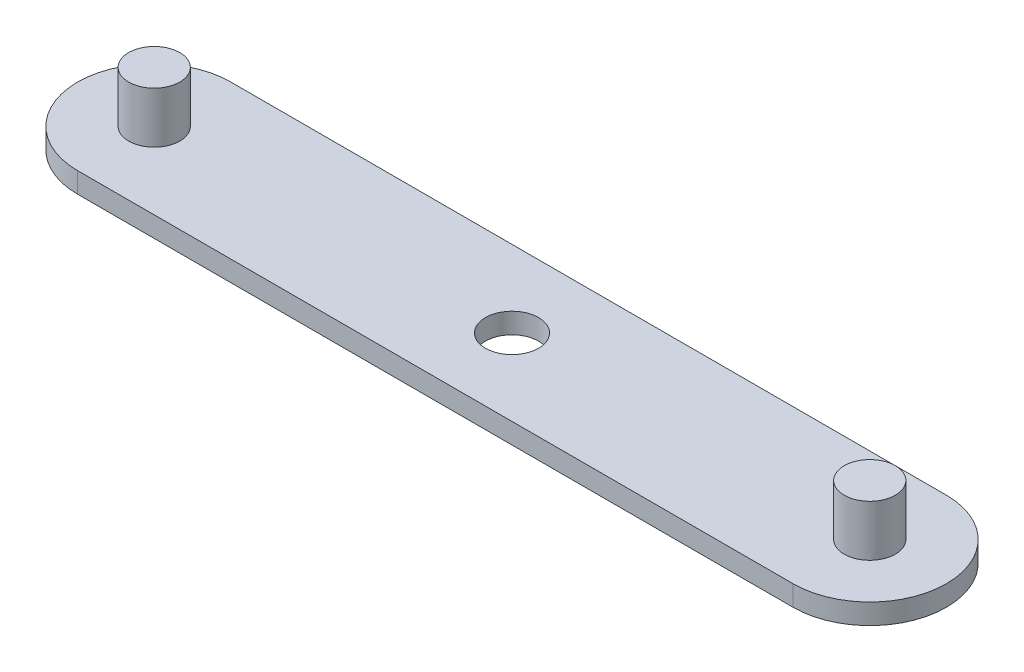
ISO-10303-21;
HEADER;
FILE_DESCRIPTION(('STEP AP214'),'2;1');
FILE_NAME('part.step','',(''),(''),'','','');
FILE_SCHEMA(('AUTOMOTIVE_DESIGN { 1 0 10303 214 1 1 1 1 }'));
ENDSEC;
DATA;
#1=APPLICATION_CONTEXT('core data for automotive mechanical design processes');
#2=APPLICATION_PROTOCOL_DEFINITION('international standard','automotive_design',2000,#1);
#3=PRODUCT_CONTEXT('',#1,'mechanical');
#4=PRODUCT('Part','Part','',(#3));
#5=PRODUCT_RELATED_PRODUCT_CATEGORY('part','',(#4));
#6=PRODUCT_DEFINITION_FORMATION('','',#4);
#7=PRODUCT_DEFINITION_CONTEXT('part definition',#1,'design');
#8=PRODUCT_DEFINITION('design','',#6,#7);
#9=PRODUCT_DEFINITION_SHAPE('','',#8);
#10=(LENGTH_UNIT() NAMED_UNIT(*) SI_UNIT(.MILLI.,.METRE.));
#11=(NAMED_UNIT(*) PLANE_ANGLE_UNIT() SI_UNIT($,.RADIAN.));
#12=(NAMED_UNIT(*) SI_UNIT($,.STERADIAN.) SOLID_ANGLE_UNIT());
#13=UNCERTAINTY_MEASURE_WITH_UNIT(LENGTH_MEASURE(1.E-05),#10,'distance_accuracy_value','');
#14=(GEOMETRIC_REPRESENTATION_CONTEXT(3) GLOBAL_UNCERTAINTY_ASSIGNED_CONTEXT((#13)) GLOBAL_UNIT_ASSIGNED_CONTEXT((#10,
#11,#12)) REPRESENTATION_CONTEXT('',''));
#15=CARTESIAN_POINT('',(0.,0.,0.));
#16=DIRECTION('',(0.,0.,1.));
#17=DIRECTION('',(1.,0.,0.));
#18=AXIS2_PLACEMENT_3D('',#15,#16,#17);
#19=CARTESIAN_POINT('',(-44.45,2.54,0.));
#20=DIRECTION('',(0.,-1.,0.));
#21=DIRECTION('',(0.,0.,-1.));
#22=AXIS2_PLACEMENT_3D('',#19,#20,#21);
#23=CYLINDRICAL_SURFACE('',#22,9.525);
#24=CARTESIAN_POINT('',(-44.45,0.,0.));
#25=DIRECTION('',(0.,1.,0.));
#26=DIRECTION('',(0.,0.,1.));
#27=AXIS2_PLACEMENT_3D('',#24,#25,#26);
#28=CIRCLE('',#27,9.525);
#29=CARTESIAN_POINT('',(-44.45,0.,9.525));
#30=VERTEX_POINT('',#29);
#31=CARTESIAN_POINT('',(-44.45,0.,-9.525));
#32=VERTEX_POINT('',#31);
#33=EDGE_CURVE('E96',#30,#32,#28,.F.);
#34=ORIENTED_EDGE('',*,*,#33,.F.);
#35=DIRECTION('',(0.,-1.,0.));
#36=VECTOR('',#35,1.);
#37=CARTESIAN_POINT('',(-44.45,2.54,9.525));
#38=LINE('',#37,#36);
#39=CARTESIAN_POINT('',(-44.45,2.54,9.525));
#40=VERTEX_POINT('',#39);
#41=EDGE_CURVE('E11',#40,#30,#38,.T.);
#42=ORIENTED_EDGE('',*,*,#41,.F.);
#43=CARTESIAN_POINT('',(-44.45,2.54,0.));
#44=DIRECTION('',(0.,1.,0.));
#45=DIRECTION('',(0.,0.,1.));
#46=AXIS2_PLACEMENT_3D('',#43,#44,#45);
#47=CIRCLE('',#46,9.525);
#48=CARTESIAN_POINT('',(-44.45,2.54,-9.525));
#49=VERTEX_POINT('',#48);
#50=EDGE_CURVE('E81',#40,#49,#47,.F.);
#51=ORIENTED_EDGE('',*,*,#50,.T.);
#52=DIRECTION('',(0.,-1.,0.));
#53=VECTOR('',#52,1.);
#54=CARTESIAN_POINT('',(-44.45,2.54,-9.525));
#55=LINE('',#54,#53);
#56=EDGE_CURVE('E49',#49,#32,#55,.T.);
#57=ORIENTED_EDGE('',*,*,#56,.T.);
#58=EDGE_LOOP('',(#34,#42,#51,#57));
#59=FACE_BOUND('',#58,.T.);
#60=ADVANCED_FACE('F33',(#59),#23,.T.);
#61=CARTESIAN_POINT('',(0.,2.54,9.525));
#62=DIRECTION('',(0.,0.,-1.));
#63=DIRECTION('',(-1.,0.,0.));
#64=AXIS2_PLACEMENT_3D('',#61,#62,#63);
#65=PLANE('',#64);
#66=DIRECTION('',(1.,0.,0.));
#67=VECTOR('',#66,1.);
#68=CARTESIAN_POINT('',(0.,0.,9.525));
#69=LINE('',#68,#67);
#70=CARTESIAN_POINT('',(44.45,0.,9.525));
#71=VERTEX_POINT('',#70);
#72=EDGE_CURVE('E87',#30,#71,#69,.T.);
#73=ORIENTED_EDGE('',*,*,#72,.T.);
#74=DIRECTION('',(0.,-1.,0.));
#75=VECTOR('',#74,1.);
#76=CARTESIAN_POINT('',(44.45,2.54,9.525));
#77=LINE('',#76,#75);
#78=CARTESIAN_POINT('',(44.45,2.54,9.525));
#79=VERTEX_POINT('',#78);
#80=EDGE_CURVE('E41',#79,#71,#77,.T.);
#81=ORIENTED_EDGE('',*,*,#80,.F.);
#82=DIRECTION('',(1.,0.,0.));
#83=VECTOR('',#82,1.);
#84=CARTESIAN_POINT('',(0.,2.54,9.525));
#85=LINE('',#84,#83);
#86=EDGE_CURVE('E75',#40,#79,#85,.T.);
#87=ORIENTED_EDGE('',*,*,#86,.F.);
#88=ORIENTED_EDGE('',*,*,#41,.T.);
#89=EDGE_LOOP('',(#73,#81,#87,#88));
#90=FACE_BOUND('',#89,.T.);
#91=ADVANCED_FACE('F85',(#90),#65,.F.);
#92=CARTESIAN_POINT('',(44.45,2.54,0.));
#93=DIRECTION('',(0.,-1.,0.));
#94=DIRECTION('',(0.,0.,-1.));
#95=AXIS2_PLACEMENT_3D('',#92,#93,#94);
#96=CYLINDRICAL_SURFACE('',#95,9.525);
#97=CARTESIAN_POINT('',(44.45,0.,0.));
#98=DIRECTION('',(0.,1.,0.));
#99=DIRECTION('',(0.,0.,1.));
#100=AXIS2_PLACEMENT_3D('',#97,#98,#99);
#101=CIRCLE('',#100,9.525);
#102=CARTESIAN_POINT('',(44.45,0.,-9.525));
#103=VERTEX_POINT('',#102);
#104=EDGE_CURVE('E100',#103,#71,#101,.F.);
#105=ORIENTED_EDGE('',*,*,#104,.F.);
#106=DIRECTION('',(0.,-1.,0.));
#107=VECTOR('',#106,1.);
#108=CARTESIAN_POINT('',(44.45,2.54,-9.525));
#109=LINE('',#108,#107);
#110=CARTESIAN_POINT('',(44.45,2.54,-9.525));
#111=VERTEX_POINT('',#110);
#112=EDGE_CURVE('E62',#111,#103,#109,.T.);
#113=ORIENTED_EDGE('',*,*,#112,.F.);
#114=CARTESIAN_POINT('',(44.45,2.54,0.));
#115=DIRECTION('',(0.,1.,0.));
#116=DIRECTION('',(0.,0.,1.));
#117=AXIS2_PLACEMENT_3D('',#114,#115,#116);
#118=CIRCLE('',#117,9.525);
#119=EDGE_CURVE('E80',#111,#79,#118,.F.);
#120=ORIENTED_EDGE('',*,*,#119,.T.);
#121=ORIENTED_EDGE('',*,*,#80,.T.);
#122=EDGE_LOOP('',(#105,#113,#120,#121));
#123=FACE_BOUND('',#122,.T.);
#124=ADVANCED_FACE('F90',(#123),#96,.T.);
#125=CARTESIAN_POINT('',(0.,2.54,-9.525));
#126=DIRECTION('',(0.,0.,-1.));
#127=DIRECTION('',(-1.,0.,0.));
#128=AXIS2_PLACEMENT_3D('',#125,#126,#127);
#129=PLANE('',#128);
#130=DIRECTION('',(1.,0.,0.));
#131=VECTOR('',#130,1.);
#132=CARTESIAN_POINT('',(0.,0.,-9.525));
#133=LINE('',#132,#131);
#134=EDGE_CURVE('E102',#32,#103,#133,.T.);
#135=ORIENTED_EDGE('',*,*,#134,.F.);
#136=ORIENTED_EDGE('',*,*,#56,.F.);
#137=DIRECTION('',(1.,0.,0.));
#138=VECTOR('',#137,1.);
#139=CARTESIAN_POINT('',(0.,2.54,-9.525));
#140=LINE('',#139,#138);
#141=EDGE_CURVE('E91',#49,#111,#140,.T.);
#142=ORIENTED_EDGE('',*,*,#141,.T.);
#143=ORIENTED_EDGE('',*,*,#112,.T.);
#144=EDGE_LOOP('',(#135,#136,#142,#143));
#145=FACE_BOUND('',#144,.T.);
#146=ADVANCED_FACE('F132',(#145),#129,.T.);
#147=CARTESIAN_POINT('',(0.,2.54,0.));
#148=DIRECTION('',(0.,1.,0.));
#149=DIRECTION('',(0.,0.,1.));
#150=AXIS2_PLACEMENT_3D('',#147,#148,#149);
#151=PLANE('',#150);
#152=CARTESIAN_POINT('',(0.,2.54,0.));
#153=DIRECTION('',(0.,1.,0.));
#154=DIRECTION('',(0.,0.,1.));
#155=AXIS2_PLACEMENT_3D('',#152,#153,#154);
#156=CIRCLE('',#155,3.302);
#157=CARTESIAN_POINT('',(0.,2.54,3.302));
#158=VERTEX_POINT('',#157);
#159=EDGE_CURVE('E122',#158,#158,#156,.T.);
#160=ORIENTED_EDGE('',*,*,#159,.F.);
#161=EDGE_LOOP('',(#160));
#162=FACE_BOUND('',#161,.T.);
#163=CARTESIAN_POINT('',(44.45,2.54,0.));
#164=DIRECTION('',(0.,1.,0.));
#165=DIRECTION('',(0.,0.,1.));
#166=AXIS2_PLACEMENT_3D('',#163,#164,#165);
#167=CIRCLE('',#166,3.175);
#168=CARTESIAN_POINT('',(44.45,2.54,3.175));
#169=VERTEX_POINT('',#168);
#170=EDGE_CURVE('E114',#169,#169,#167,.T.);
#171=ORIENTED_EDGE('',*,*,#170,.F.);
#172=EDGE_LOOP('',(#171));
#173=FACE_BOUND('',#172,.T.);
#174=CARTESIAN_POINT('',(-44.45,2.54,0.));
#175=DIRECTION('',(0.,1.,0.));
#176=DIRECTION('',(0.,0.,1.));
#177=AXIS2_PLACEMENT_3D('',#174,#175,#176);
#178=CIRCLE('',#177,3.175);
#179=CARTESIAN_POINT('',(-44.45,2.54,3.175));
#180=VERTEX_POINT('',#179);
#181=EDGE_CURVE('E108',#180,#180,#178,.T.);
#182=ORIENTED_EDGE('',*,*,#181,.F.);
#183=EDGE_LOOP('',(#182));
#184=FACE_BOUND('',#183,.T.);
#185=ORIENTED_EDGE('',*,*,#50,.F.);
#186=ORIENTED_EDGE('',*,*,#86,.T.);
#187=ORIENTED_EDGE('',*,*,#119,.F.);
#188=ORIENTED_EDGE('',*,*,#141,.F.);
#189=EDGE_LOOP('',(#185,#186,#187,#188));
#190=FACE_BOUND('',#189,.T.);
#191=ADVANCED_FACE('F77',(#162,#173,#184,#190),#151,.T.);
#192=CARTESIAN_POINT('',(0.,0.,0.));
#193=DIRECTION('',(0.,1.,0.));
#194=DIRECTION('',(0.,0.,1.));
#195=AXIS2_PLACEMENT_3D('',#192,#193,#194);
#196=PLANE('',#195);
#197=CARTESIAN_POINT('',(0.,0.,0.));
#198=DIRECTION('',(0.,1.,0.));
#199=DIRECTION('',(0.,0.,1.));
#200=AXIS2_PLACEMENT_3D('',#197,#198,#199);
#201=CIRCLE('',#200,3.302);
#202=CARTESIAN_POINT('',(0.,0.,3.302));
#203=VERTEX_POINT('',#202);
#204=EDGE_CURVE('E117',#203,#203,#201,.F.);
#205=ORIENTED_EDGE('',*,*,#204,.F.);
#206=EDGE_LOOP('',(#205));
#207=FACE_BOUND('',#206,.T.);
#208=ORIENTED_EDGE('',*,*,#33,.T.);
#209=ORIENTED_EDGE('',*,*,#134,.T.);
#210=ORIENTED_EDGE('',*,*,#104,.T.);
#211=ORIENTED_EDGE('',*,*,#72,.F.);
#212=EDGE_LOOP('',(#208,#209,#210,#211));
#213=FACE_BOUND('',#212,.T.);
#214=ADVANCED_FACE('F131',(#207,#213),#196,.F.);
#215=CARTESIAN_POINT('',(-44.45,8.89,0.));
#216=DIRECTION('',(0.,-1.,0.));
#217=DIRECTION('',(0.,0.,-1.));
#218=AXIS2_PLACEMENT_3D('',#215,#216,#217);
#219=CYLINDRICAL_SURFACE('',#218,3.175);
#220=CARTESIAN_POINT('',(-44.45,8.89,0.));
#221=DIRECTION('',(0.,1.,0.));
#222=DIRECTION('',(0.,0.,1.));
#223=AXIS2_PLACEMENT_3D('',#220,#221,#222);
#224=CIRCLE('',#223,3.175);
#225=CARTESIAN_POINT('',(-44.45,8.89,3.175));
#226=VERTEX_POINT('',#225);
#227=EDGE_CURVE('E98',#226,#226,#224,.T.);
#228=ORIENTED_EDGE('',*,*,#227,.F.);
#229=EDGE_LOOP('',(#228));
#230=FACE_BOUND('',#229,.T.);
#231=ORIENTED_EDGE('',*,*,#181,.T.);
#232=EDGE_LOOP('',(#231));
#233=FACE_BOUND('',#232,.T.);
#234=ADVANCED_FACE('F138',(#230,#233),#219,.T.);
#235=CARTESIAN_POINT('',(-44.45,8.89,0.));
#236=DIRECTION('',(0.,1.,0.));
#237=DIRECTION('',(0.,0.,1.));
#238=AXIS2_PLACEMENT_3D('',#235,#236,#237);
#239=PLANE('',#238);
#240=ORIENTED_EDGE('',*,*,#227,.T.);
#241=EDGE_LOOP('',(#240));
#242=FACE_BOUND('',#241,.T.);
#243=ADVANCED_FACE('F140',(#242),#239,.T.);
#244=CARTESIAN_POINT('',(44.45,8.89,0.));
#245=DIRECTION('',(0.,-1.,0.));
#246=DIRECTION('',(0.,0.,-1.));
#247=AXIS2_PLACEMENT_3D('',#244,#245,#246);
#248=CYLINDRICAL_SURFACE('',#247,3.175);
#249=CARTESIAN_POINT('',(44.45,8.89,0.));
#250=DIRECTION('',(0.,1.,0.));
#251=DIRECTION('',(0.,0.,1.));
#252=AXIS2_PLACEMENT_3D('',#249,#250,#251);
#253=CIRCLE('',#252,3.175);
#254=CARTESIAN_POINT('',(44.45,8.89,3.175));
#255=VERTEX_POINT('',#254);
#256=EDGE_CURVE('E111',#255,#255,#253,.T.);
#257=ORIENTED_EDGE('',*,*,#256,.F.);
#258=EDGE_LOOP('',(#257));
#259=FACE_BOUND('',#258,.T.);
#260=ORIENTED_EDGE('',*,*,#170,.T.);
#261=EDGE_LOOP('',(#260));
#262=FACE_BOUND('',#261,.T.);
#263=ADVANCED_FACE('F147',(#259,#262),#248,.T.);
#264=CARTESIAN_POINT('',(44.45,8.89,0.));
#265=DIRECTION('',(0.,1.,0.));
#266=DIRECTION('',(0.,0.,1.));
#267=AXIS2_PLACEMENT_3D('',#264,#265,#266);
#268=PLANE('',#267);
#269=ORIENTED_EDGE('',*,*,#256,.T.);
#270=EDGE_LOOP('',(#269));
#271=FACE_BOUND('',#270,.T.);
#272=ADVANCED_FACE('F222',(#271),#268,.T.);
#273=CARTESIAN_POINT('',(0.,-0.00100000000000013,0.));
#274=DIRECTION('',(0.,1.,0.));
#275=DIRECTION('',(0.,0.,1.));
#276=AXIS2_PLACEMENT_3D('',#273,#274,#275);
#277=CYLINDRICAL_SURFACE('',#276,3.302);
#278=ORIENTED_EDGE('',*,*,#159,.T.);
#279=EDGE_LOOP('',(#278));
#280=FACE_BOUND('',#279,.T.);
#281=ORIENTED_EDGE('',*,*,#204,.T.);
#282=EDGE_LOOP('',(#281));
#283=FACE_BOUND('',#282,.T.);
#284=ADVANCED_FACE('F126',(#280,#283),#277,.F.);
#285=CLOSED_SHELL('',(#60,#91,#124,#146,#191,#214,#234,#243,#263,#272,#284));
#286=MANIFOLD_SOLID_BREP('B2',#285);
#287=ADVANCED_BREP_SHAPE_REPRESENTATION('',(#18,#286),#14);
#288=SHAPE_DEFINITION_REPRESENTATION(#9,#287);
ENDSEC;
END-ISO-10303-21;
